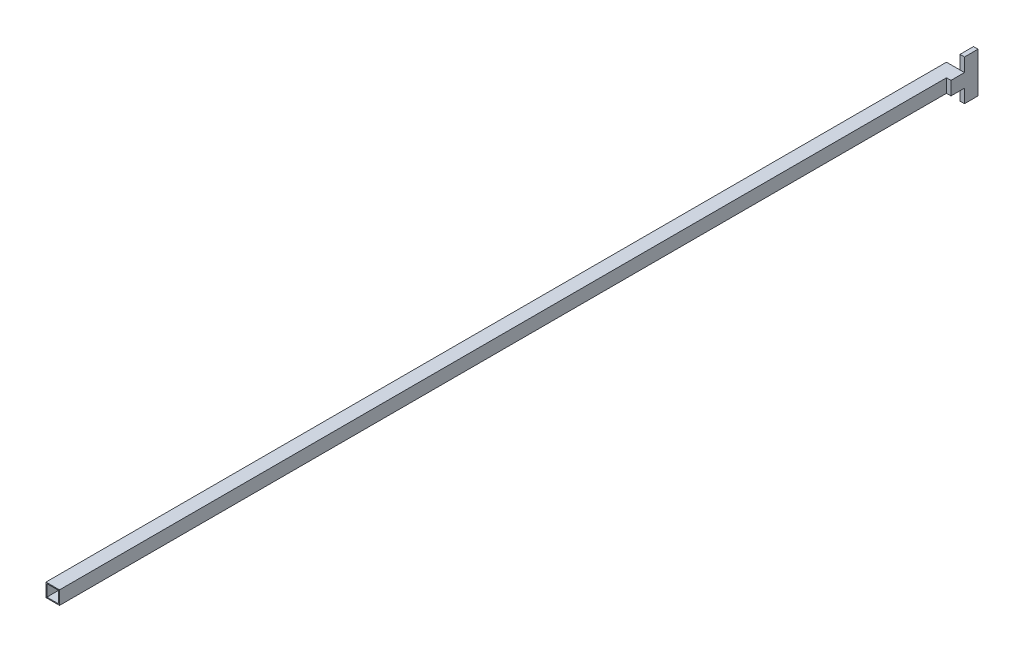
ISO-10303-21;
HEADER;
FILE_DESCRIPTION(('STEP AP214'),'2;1');
FILE_NAME('part.step','',(''),(''),'','','');
FILE_SCHEMA(('AUTOMOTIVE_DESIGN { 1 0 10303 214 1 1 1 1 }'));
ENDSEC;
DATA;
#1=APPLICATION_CONTEXT('core data for automotive mechanical design processes');
#2=APPLICATION_PROTOCOL_DEFINITION('international standard','automotive_design',2000,#1);
#3=PRODUCT_CONTEXT('',#1,'mechanical');
#4=PRODUCT('Part','Part','',(#3));
#5=PRODUCT_RELATED_PRODUCT_CATEGORY('part','',(#4));
#6=PRODUCT_DEFINITION_FORMATION('','',#4);
#7=PRODUCT_DEFINITION_CONTEXT('part definition',#1,'design');
#8=PRODUCT_DEFINITION('design','',#6,#7);
#9=PRODUCT_DEFINITION_SHAPE('','',#8);
#10=(LENGTH_UNIT() NAMED_UNIT(*) SI_UNIT(.MILLI.,.METRE.));
#11=(NAMED_UNIT(*) PLANE_ANGLE_UNIT() SI_UNIT($,.RADIAN.));
#12=(NAMED_UNIT(*) SI_UNIT($,.STERADIAN.) SOLID_ANGLE_UNIT());
#13=UNCERTAINTY_MEASURE_WITH_UNIT(LENGTH_MEASURE(1.E-05),#10,'distance_accuracy_value','');
#14=(GEOMETRIC_REPRESENTATION_CONTEXT(3) GLOBAL_UNCERTAINTY_ASSIGNED_CONTEXT((#13)) GLOBAL_UNIT_ASSIGNED_CONTEXT((#10,
#11,#12)) REPRESENTATION_CONTEXT('',''));
#15=CARTESIAN_POINT('',(0.,0.,0.));
#16=DIRECTION('',(0.,0.,1.));
#17=DIRECTION('',(1.,0.,0.));
#18=AXIS2_PLACEMENT_3D('',#15,#16,#17);
#19=CARTESIAN_POINT('',(15.,15.,2000.));
#20=DIRECTION('',(-1.,0.,0.));
#21=DIRECTION('',(0.,0.,1.));
#22=AXIS2_PLACEMENT_3D('',#19,#20,#21);
#23=PLANE('',#22);
#24=DIRECTION('',(0.,-1.,0.));
#25=VECTOR('',#24,1.);
#26=CARTESIAN_POINT('',(15.,15.,30.));
#27=LINE('',#26,#25);
#28=CARTESIAN_POINT('',(15.,15.,30.));
#29=VERTEX_POINT('',#28);
#30=CARTESIAN_POINT('',(15.,-15.,30.));
#31=VERTEX_POINT('',#30);
#32=EDGE_CURVE('E55',#29,#31,#27,.T.);
#33=ORIENTED_EDGE('',*,*,#32,.F.);
#34=DIRECTION('',(0.,0.,-1.));
#35=VECTOR('',#34,1.);
#36=CARTESIAN_POINT('',(15.,15.,2000.));
#37=LINE('',#36,#35);
#38=CARTESIAN_POINT('',(15.,15.,2000.));
#39=VERTEX_POINT('',#38);
#40=EDGE_CURVE('E308',#39,#29,#37,.T.);
#41=ORIENTED_EDGE('',*,*,#40,.F.);
#42=DIRECTION('',(0.,1.,0.));
#43=VECTOR('',#42,1.);
#44=CARTESIAN_POINT('',(15.,15.,2000.));
#45=LINE('',#44,#43);
#46=CARTESIAN_POINT('',(15.,-15.,2000.));
#47=VERTEX_POINT('',#46);
#48=EDGE_CURVE('E286',#47,#39,#45,.T.);
#49=ORIENTED_EDGE('',*,*,#48,.F.);
#50=DIRECTION('',(0.,0.,-1.));
#51=VECTOR('',#50,1.);
#52=CARTESIAN_POINT('',(15.,-15.,2000.));
#53=LINE('',#52,#51);
#54=EDGE_CURVE('E48',#47,#31,#53,.T.);
#55=ORIENTED_EDGE('',*,*,#54,.T.);
#56=EDGE_LOOP('',(#33,#41,#49,#55));
#57=FACE_BOUND('',#56,.T.);
#58=ADVANCED_FACE('F39',(#57),#23,.F.);
#59=CARTESIAN_POINT('',(0.,0.,2000.));
#60=DIRECTION('',(0.,0.,-1.));
#61=DIRECTION('',(-1.,0.,0.));
#62=AXIS2_PLACEMENT_3D('',#59,#60,#61);
#63=PLANE('',#62);
#64=DIRECTION('',(0.,-1.,0.));
#65=VECTOR('',#64,1.);
#66=CARTESIAN_POINT('',(-15.,15.,2000.));
#67=LINE('',#66,#65);
#68=CARTESIAN_POINT('',(-15.,15.,2000.));
#69=VERTEX_POINT('',#68);
#70=CARTESIAN_POINT('',(-15.,-15.,2000.));
#71=VERTEX_POINT('',#70);
#72=EDGE_CURVE('E278',#69,#71,#67,.T.);
#73=ORIENTED_EDGE('',*,*,#72,.T.);
#74=DIRECTION('',(1.,0.,0.));
#75=VECTOR('',#74,1.);
#76=CARTESIAN_POINT('',(15.,-15.,2000.));
#77=LINE('',#76,#75);
#78=EDGE_CURVE('E282',#71,#47,#77,.T.);
#79=ORIENTED_EDGE('',*,*,#78,.T.);
#80=ORIENTED_EDGE('',*,*,#48,.T.);
#81=DIRECTION('',(-1.,0.,0.));
#82=VECTOR('',#81,1.);
#83=CARTESIAN_POINT('',(15.,15.,2000.));
#84=LINE('',#83,#82);
#85=EDGE_CURVE('E289',#39,#69,#84,.T.);
#86=ORIENTED_EDGE('',*,*,#85,.T.);
#87=EDGE_LOOP('',(#73,#79,#80,#86));
#88=FACE_BOUND('',#87,.T.);
#89=DIRECTION('',(0.,-1.,0.));
#90=VECTOR('',#89,1.);
#91=CARTESIAN_POINT('',(-13.,13.,2000.));
#92=LINE('',#91,#90);
#93=CARTESIAN_POINT('',(-13.,13.,2000.));
#94=VERTEX_POINT('',#93);
#95=CARTESIAN_POINT('',(-13.,-13.,2000.));
#96=VERTEX_POINT('',#95);
#97=EDGE_CURVE('E237',#94,#96,#92,.T.);
#98=ORIENTED_EDGE('',*,*,#97,.F.);
#99=DIRECTION('',(-1.,0.,0.));
#100=VECTOR('',#99,1.);
#101=CARTESIAN_POINT('',(13.,13.,2000.));
#102=LINE('',#101,#100);
#103=CARTESIAN_POINT('',(13.,13.,2000.));
#104=VERTEX_POINT('',#103);
#105=EDGE_CURVE('E247',#104,#94,#102,.T.);
#106=ORIENTED_EDGE('',*,*,#105,.F.);
#107=DIRECTION('',(0.,1.,0.));
#108=VECTOR('',#107,1.);
#109=CARTESIAN_POINT('',(13.,13.,2000.));
#110=LINE('',#109,#108);
#111=CARTESIAN_POINT('',(13.,-13.,2000.));
#112=VERTEX_POINT('',#111);
#113=EDGE_CURVE('E244',#112,#104,#110,.T.);
#114=ORIENTED_EDGE('',*,*,#113,.F.);
#115=DIRECTION('',(1.,0.,0.));
#116=VECTOR('',#115,1.);
#117=CARTESIAN_POINT('',(13.,-13.,2000.));
#118=LINE('',#117,#116);
#119=EDGE_CURVE('E240',#96,#112,#118,.T.);
#120=ORIENTED_EDGE('',*,*,#119,.F.);
#121=EDGE_LOOP('',(#98,#106,#114,#120));
#122=FACE_BOUND('',#121,.T.);
#123=ADVANCED_FACE('F349',(#88,#122),#63,.F.);
#124=CARTESIAN_POINT('',(0.,0.,0.));
#125=DIRECTION('',(0.,0.,-1.));
#126=DIRECTION('',(-1.,0.,0.));
#127=AXIS2_PLACEMENT_3D('',#124,#125,#126);
#128=PLANE('',#127);
#129=DIRECTION('',(0.,-1.,0.));
#130=VECTOR('',#129,1.);
#131=CARTESIAN_POINT('',(-15.,15.,0.));
#132=LINE('',#131,#130);
#133=CARTESIAN_POINT('',(-15.,15.,0.));
#134=VERTEX_POINT('',#133);
#135=CARTESIAN_POINT('',(-15.,-15.,0.));
#136=VERTEX_POINT('',#135);
#137=EDGE_CURVE('E277',#134,#136,#132,.T.);
#138=ORIENTED_EDGE('',*,*,#137,.F.);
#139=DIRECTION('',(-1.,0.,0.));
#140=VECTOR('',#139,1.);
#141=CARTESIAN_POINT('',(15.,15.,0.));
#142=LINE('',#141,#140);
#143=CARTESIAN_POINT('',(15.,15.,0.));
#144=VERTEX_POINT('',#143);
#145=EDGE_CURVE('E283',#144,#134,#142,.T.);
#146=ORIENTED_EDGE('',*,*,#145,.F.);
#147=DIRECTION('',(0.,1.,0.));
#148=VECTOR('',#147,1.);
#149=CARTESIAN_POINT('',(15.,15.,0.));
#150=LINE('',#149,#148);
#151=CARTESIAN_POINT('',(15.,-15.,0.));
#152=VERTEX_POINT('',#151);
#153=EDGE_CURVE('E299',#152,#144,#150,.T.);
#154=ORIENTED_EDGE('',*,*,#153,.F.);
#155=DIRECTION('',(1.,0.,0.));
#156=VECTOR('',#155,1.);
#157=CARTESIAN_POINT('',(15.,-15.,0.));
#158=LINE('',#157,#156);
#159=EDGE_CURVE('E296',#136,#152,#158,.T.);
#160=ORIENTED_EDGE('',*,*,#159,.F.);
#161=EDGE_LOOP('',(#138,#146,#154,#160));
#162=FACE_BOUND('',#161,.T.);
#163=DIRECTION('',(-1.,0.,0.));
#164=VECTOR('',#163,1.);
#165=CARTESIAN_POINT('',(13.,13.,0.));
#166=LINE('',#165,#164);
#167=CARTESIAN_POINT('',(13.,13.,0.));
#168=VERTEX_POINT('',#167);
#169=CARTESIAN_POINT('',(-13.,13.,0.));
#170=VERTEX_POINT('',#169);
#171=EDGE_CURVE('E241',#168,#170,#166,.T.);
#172=ORIENTED_EDGE('',*,*,#171,.T.);
#173=DIRECTION('',(0.,-1.,0.));
#174=VECTOR('',#173,1.);
#175=CARTESIAN_POINT('',(-13.,13.,0.));
#176=LINE('',#175,#174);
#177=CARTESIAN_POINT('',(-13.,-13.,0.));
#178=VERTEX_POINT('',#177);
#179=EDGE_CURVE('E216',#170,#178,#176,.T.);
#180=ORIENTED_EDGE('',*,*,#179,.T.);
#181=DIRECTION('',(1.,0.,0.));
#182=VECTOR('',#181,1.);
#183=CARTESIAN_POINT('',(13.,-13.,0.));
#184=LINE('',#183,#182);
#185=CARTESIAN_POINT('',(13.,-13.,0.));
#186=VERTEX_POINT('',#185);
#187=EDGE_CURVE('E254',#178,#186,#184,.T.);
#188=ORIENTED_EDGE('',*,*,#187,.T.);
#189=DIRECTION('',(0.,1.,0.));
#190=VECTOR('',#189,1.);
#191=CARTESIAN_POINT('',(13.,13.,0.));
#192=LINE('',#191,#190);
#193=EDGE_CURVE('E258',#186,#168,#192,.T.);
#194=ORIENTED_EDGE('',*,*,#193,.T.);
#195=EDGE_LOOP('',(#172,#180,#188,#194));
#196=FACE_BOUND('',#195,.T.);
#197=ADVANCED_FACE('F341',(#162,#196),#128,.T.);
#198=CARTESIAN_POINT('',(-15.,15.,2000.));
#199=DIRECTION('',(1.,0.,0.));
#200=DIRECTION('',(0.,0.,-1.));
#201=AXIS2_PLACEMENT_3D('',#198,#199,#200);
#202=PLANE('',#201);
#203=ORIENTED_EDGE('',*,*,#137,.T.);
#204=DIRECTION('',(0.,0.,-1.));
#205=VECTOR('',#204,1.);
#206=CARTESIAN_POINT('',(-15.,-15.,2000.));
#207=LINE('',#206,#205);
#208=EDGE_CURVE('E11',#71,#136,#207,.T.);
#209=ORIENTED_EDGE('',*,*,#208,.F.);
#210=ORIENTED_EDGE('',*,*,#72,.F.);
#211=DIRECTION('',(0.,0.,-1.));
#212=VECTOR('',#211,1.);
#213=CARTESIAN_POINT('',(-15.,15.,2000.));
#214=LINE('',#213,#212);
#215=EDGE_CURVE('E292',#69,#134,#214,.T.);
#216=ORIENTED_EDGE('',*,*,#215,.T.);
#217=EDGE_LOOP('',(#203,#209,#210,#216));
#218=FACE_BOUND('',#217,.T.);
#219=ADVANCED_FACE('F41',(#218),#202,.F.);
#220=CARTESIAN_POINT('',(15.,-15.,2000.));
#221=DIRECTION('',(0.,1.,0.));
#222=DIRECTION('',(0.,0.,1.));
#223=AXIS2_PLACEMENT_3D('',#220,#221,#222);
#224=PLANE('',#223);
#225=ORIENTED_EDGE('',*,*,#159,.T.);
#226=DIRECTION('',(-1.,0.,0.));
#227=VECTOR('',#226,1.);
#228=CARTESIAN_POINT('',(25.,-15.,0.));
#229=LINE('',#228,#227);
#230=CARTESIAN_POINT('',(25.,-15.,0.));
#231=VERTEX_POINT('',#230);
#232=EDGE_CURVE('E221',#231,#152,#229,.T.);
#233=ORIENTED_EDGE('',*,*,#232,.F.);
#234=DIRECTION('',(0.,0.,-1.));
#235=VECTOR('',#234,1.);
#236=CARTESIAN_POINT('',(25.,-15.,30.));
#237=LINE('',#236,#235);
#238=CARTESIAN_POINT('',(25.,-15.,30.));
#239=VERTEX_POINT('',#238);
#240=EDGE_CURVE('E192',#239,#231,#237,.T.);
#241=ORIENTED_EDGE('',*,*,#240,.F.);
#242=DIRECTION('',(-1.,0.,0.));
#243=VECTOR('',#242,1.);
#244=CARTESIAN_POINT('',(25.,-15.,30.));
#245=LINE('',#244,#243);
#246=EDGE_CURVE('E217',#239,#31,#245,.T.);
#247=ORIENTED_EDGE('',*,*,#246,.T.);
#248=ORIENTED_EDGE('',*,*,#54,.F.);
#249=ORIENTED_EDGE('',*,*,#78,.F.);
#250=ORIENTED_EDGE('',*,*,#208,.T.);
#251=EDGE_LOOP('',(#225,#233,#241,#247,#248,#249,#250));
#252=FACE_BOUND('',#251,.T.);
#253=ADVANCED_FACE('F318',(#252),#224,.F.);
#254=CARTESIAN_POINT('',(15.,15.,2000.));
#255=DIRECTION('',(0.,-1.,0.));
#256=DIRECTION('',(0.,0.,-1.));
#257=AXIS2_PLACEMENT_3D('',#254,#255,#256);
#258=PLANE('',#257);
#259=ORIENTED_EDGE('',*,*,#145,.T.);
#260=ORIENTED_EDGE('',*,*,#215,.F.);
#261=ORIENTED_EDGE('',*,*,#85,.F.);
#262=ORIENTED_EDGE('',*,*,#40,.T.);
#263=DIRECTION('',(-1.,0.,0.));
#264=VECTOR('',#263,1.);
#265=CARTESIAN_POINT('',(25.,15.,30.));
#266=LINE('',#265,#264);
#267=CARTESIAN_POINT('',(25.,15.,30.));
#268=VERTEX_POINT('',#267);
#269=EDGE_CURVE('E172',#268,#29,#266,.T.);
#270=ORIENTED_EDGE('',*,*,#269,.F.);
#271=DIRECTION('',(0.,0.,-1.));
#272=VECTOR('',#271,1.);
#273=CARTESIAN_POINT('',(25.,15.,30.));
#274=LINE('',#273,#272);
#275=CARTESIAN_POINT('',(25.,15.,0.));
#276=VERTEX_POINT('',#275);
#277=EDGE_CURVE('E164',#268,#276,#274,.T.);
#278=ORIENTED_EDGE('',*,*,#277,.T.);
#279=DIRECTION('',(-1.,0.,0.));
#280=VECTOR('',#279,1.);
#281=CARTESIAN_POINT('',(25.,15.,0.));
#282=LINE('',#281,#280);
#283=EDGE_CURVE('E149',#276,#144,#282,.T.);
#284=ORIENTED_EDGE('',*,*,#283,.T.);
#285=EDGE_LOOP('',(#259,#260,#261,#262,#270,#278,#284));
#286=FACE_BOUND('',#285,.T.);
#287=ADVANCED_FACE('F170',(#286),#258,.F.);
#288=CARTESIAN_POINT('',(-13.,13.,2000.));
#289=DIRECTION('',(1.,0.,0.));
#290=DIRECTION('',(0.,0.,-1.));
#291=AXIS2_PLACEMENT_3D('',#288,#289,#290);
#292=PLANE('',#291);
#293=ORIENTED_EDGE('',*,*,#179,.F.);
#294=DIRECTION('',(0.,0.,-1.));
#295=VECTOR('',#294,1.);
#296=CARTESIAN_POINT('',(-13.,13.,2000.));
#297=LINE('',#296,#295);
#298=EDGE_CURVE('E250',#94,#170,#297,.T.);
#299=ORIENTED_EDGE('',*,*,#298,.F.);
#300=ORIENTED_EDGE('',*,*,#97,.T.);
#301=DIRECTION('',(0.,0.,-1.));
#302=VECTOR('',#301,1.);
#303=CARTESIAN_POINT('',(-13.,-13.,2000.));
#304=LINE('',#303,#302);
#305=EDGE_CURVE('E273',#96,#178,#304,.T.);
#306=ORIENTED_EDGE('',*,*,#305,.T.);
#307=EDGE_LOOP('',(#293,#299,#300,#306));
#308=FACE_BOUND('',#307,.T.);
#309=ADVANCED_FACE('F360',(#308),#292,.T.);
#310=CARTESIAN_POINT('',(13.,-13.,2000.));
#311=DIRECTION('',(0.,1.,0.));
#312=DIRECTION('',(0.,0.,1.));
#313=AXIS2_PLACEMENT_3D('',#310,#311,#312);
#314=PLANE('',#313);
#315=ORIENTED_EDGE('',*,*,#187,.F.);
#316=ORIENTED_EDGE('',*,*,#305,.F.);
#317=ORIENTED_EDGE('',*,*,#119,.T.);
#318=DIRECTION('',(0.,0.,-1.));
#319=VECTOR('',#318,1.);
#320=CARTESIAN_POINT('',(13.,-13.,2000.));
#321=LINE('',#320,#319);
#322=EDGE_CURVE('E270',#112,#186,#321,.T.);
#323=ORIENTED_EDGE('',*,*,#322,.T.);
#324=EDGE_LOOP('',(#315,#316,#317,#323));
#325=FACE_BOUND('',#324,.T.);
#326=ADVANCED_FACE('F362',(#325),#314,.T.);
#327=CARTESIAN_POINT('',(13.,13.,2000.));
#328=DIRECTION('',(-1.,0.,0.));
#329=DIRECTION('',(0.,0.,1.));
#330=AXIS2_PLACEMENT_3D('',#327,#328,#329);
#331=PLANE('',#330);
#332=ORIENTED_EDGE('',*,*,#193,.F.);
#333=ORIENTED_EDGE('',*,*,#322,.F.);
#334=ORIENTED_EDGE('',*,*,#113,.T.);
#335=DIRECTION('',(0.,0.,-1.));
#336=VECTOR('',#335,1.);
#337=CARTESIAN_POINT('',(13.,13.,2000.));
#338=LINE('',#337,#336);
#339=EDGE_CURVE('E63',#104,#168,#338,.T.);
#340=ORIENTED_EDGE('',*,*,#339,.T.);
#341=EDGE_LOOP('',(#332,#333,#334,#340));
#342=FACE_BOUND('',#341,.T.);
#343=ADVANCED_FACE('F367',(#342),#331,.T.);
#344=CARTESIAN_POINT('',(13.,13.,2000.));
#345=DIRECTION('',(0.,-1.,0.));
#346=DIRECTION('',(0.,0.,-1.));
#347=AXIS2_PLACEMENT_3D('',#344,#345,#346);
#348=PLANE('',#347);
#349=ORIENTED_EDGE('',*,*,#171,.F.);
#350=ORIENTED_EDGE('',*,*,#339,.F.);
#351=ORIENTED_EDGE('',*,*,#105,.T.);
#352=ORIENTED_EDGE('',*,*,#298,.T.);
#353=EDGE_LOOP('',(#349,#350,#351,#352));
#354=FACE_BOUND('',#353,.T.);
#355=ADVANCED_FACE('F365',(#354),#348,.T.);
#356=CARTESIAN_POINT('',(15.,0.,0.));
#357=DIRECTION('',(1.,0.,0.));
#358=DIRECTION('',(0.,0.,-1.));
#359=AXIS2_PLACEMENT_3D('',#356,#357,#358);
#360=PLANE('',#359);
#361=DIRECTION('',(0.,-1.,0.));
#362=VECTOR('',#361,1.);
#363=CARTESIAN_POINT('',(15.,-15.,0.));
#364=LINE('',#363,#362);
#365=CARTESIAN_POINT('',(15.,-45.,0.));
#366=VERTEX_POINT('',#365);
#367=EDGE_CURVE('E177',#152,#366,#364,.T.);
#368=ORIENTED_EDGE('',*,*,#367,.F.);
#369=ORIENTED_EDGE('',*,*,#153,.T.);
#370=DIRECTION('',(0.,1.,0.));
#371=VECTOR('',#370,1.);
#372=CARTESIAN_POINT('',(15.,15.,0.));
#373=LINE('',#372,#371);
#374=CARTESIAN_POINT('',(15.,45.,0.));
#375=VERTEX_POINT('',#374);
#376=EDGE_CURVE('E154',#144,#375,#373,.T.);
#377=ORIENTED_EDGE('',*,*,#376,.T.);
#378=DIRECTION('',(0.,0.,1.));
#379=VECTOR('',#378,1.);
#380=CARTESIAN_POINT('',(15.,45.,-30.));
#381=LINE('',#380,#379);
#382=CARTESIAN_POINT('',(15.,45.,-30.));
#383=VERTEX_POINT('',#382);
#384=EDGE_CURVE('E199',#383,#375,#381,.T.);
#385=ORIENTED_EDGE('',*,*,#384,.F.);
#386=DIRECTION('',(0.,-1.,0.));
#387=VECTOR('',#386,1.);
#388=CARTESIAN_POINT('',(15.,-15.,-30.));
#389=LINE('',#388,#387);
#390=CARTESIAN_POINT('',(15.,-45.,-30.));
#391=VERTEX_POINT('',#390);
#392=EDGE_CURVE('E203',#383,#391,#389,.T.);
#393=ORIENTED_EDGE('',*,*,#392,.T.);
#394=DIRECTION('',(0.,0.,1.));
#395=VECTOR('',#394,1.);
#396=CARTESIAN_POINT('',(15.,-45.,-30.));
#397=LINE('',#396,#395);
#398=EDGE_CURVE('E207',#391,#366,#397,.T.);
#399=ORIENTED_EDGE('',*,*,#398,.T.);
#400=EDGE_LOOP('',(#368,#369,#377,#385,#393,#399));
#401=FACE_BOUND('',#400,.T.);
#402=ADVANCED_FACE('F337',(#401),#360,.F.);
#403=CARTESIAN_POINT('',(25.,15.,30.));
#404=DIRECTION('',(0.,0.,-1.));
#405=DIRECTION('',(0.,1.,0.));
#406=AXIS2_PLACEMENT_3D('',#403,#404,#405);
#407=PLANE('',#406);
#408=ORIENTED_EDGE('',*,*,#32,.T.);
#409=ORIENTED_EDGE('',*,*,#246,.F.);
#410=DIRECTION('',(0.,-1.,0.));
#411=VECTOR('',#410,1.);
#412=CARTESIAN_POINT('',(25.,15.,30.));
#413=LINE('',#412,#411);
#414=EDGE_CURVE('E159',#268,#239,#413,.T.);
#415=ORIENTED_EDGE('',*,*,#414,.F.);
#416=ORIENTED_EDGE('',*,*,#269,.T.);
#417=EDGE_LOOP('',(#408,#409,#415,#416));
#418=FACE_BOUND('',#417,.T.);
#419=ADVANCED_FACE('F316',(#418),#407,.F.);
#420=CARTESIAN_POINT('',(25.,-15.,0.));
#421=DIRECTION('',(0.,0.,-1.));
#422=DIRECTION('',(0.,1.,0.));
#423=AXIS2_PLACEMENT_3D('',#420,#421,#422);
#424=PLANE('',#423);
#425=ORIENTED_EDGE('',*,*,#367,.T.);
#426=DIRECTION('',(-1.,0.,0.));
#427=VECTOR('',#426,1.);
#428=CARTESIAN_POINT('',(25.,-45.,0.));
#429=LINE('',#428,#427);
#430=CARTESIAN_POINT('',(25.,-45.,0.));
#431=VERTEX_POINT('',#430);
#432=EDGE_CURVE('E225',#431,#366,#429,.T.);
#433=ORIENTED_EDGE('',*,*,#432,.F.);
#434=DIRECTION('',(0.,-1.,0.));
#435=VECTOR('',#434,1.);
#436=CARTESIAN_POINT('',(25.,-15.,0.));
#437=LINE('',#436,#435);
#438=EDGE_CURVE('E189',#231,#431,#437,.T.);
#439=ORIENTED_EDGE('',*,*,#438,.F.);
#440=ORIENTED_EDGE('',*,*,#232,.T.);
#441=EDGE_LOOP('',(#425,#433,#439,#440));
#442=FACE_BOUND('',#441,.T.);
#443=ADVANCED_FACE('F324',(#442),#424,.F.);
#444=CARTESIAN_POINT('',(25.,-45.,-30.));
#445=DIRECTION('',(0.,-1.,0.));
#446=DIRECTION('',(0.,0.,-1.));
#447=AXIS2_PLACEMENT_3D('',#444,#445,#446);
#448=PLANE('',#447);
#449=ORIENTED_EDGE('',*,*,#398,.F.);
#450=DIRECTION('',(-1.,0.,0.));
#451=VECTOR('',#450,1.);
#452=CARTESIAN_POINT('',(25.,-45.,-30.));
#453=LINE('',#452,#451);
#454=CARTESIAN_POINT('',(25.,-45.,-30.));
#455=VERTEX_POINT('',#454);
#456=EDGE_CURVE('E228',#455,#391,#453,.T.);
#457=ORIENTED_EDGE('',*,*,#456,.F.);
#458=DIRECTION('',(0.,0.,1.));
#459=VECTOR('',#458,1.);
#460=CARTESIAN_POINT('',(25.,-45.,-30.));
#461=LINE('',#460,#459);
#462=EDGE_CURVE('E185',#455,#431,#461,.T.);
#463=ORIENTED_EDGE('',*,*,#462,.T.);
#464=ORIENTED_EDGE('',*,*,#432,.T.);
#465=EDGE_LOOP('',(#449,#457,#463,#464));
#466=FACE_BOUND('',#465,.T.);
#467=ADVANCED_FACE('F329',(#466),#448,.T.);
#468=CARTESIAN_POINT('',(25.,-15.,-30.));
#469=DIRECTION('',(0.,0.,-1.));
#470=DIRECTION('',(0.,1.,0.));
#471=AXIS2_PLACEMENT_3D('',#468,#469,#470);
#472=PLANE('',#471);
#473=ORIENTED_EDGE('',*,*,#392,.F.);
#474=DIRECTION('',(-1.,0.,0.));
#475=VECTOR('',#474,1.);
#476=CARTESIAN_POINT('',(25.,45.,-30.));
#477=LINE('',#476,#475);
#478=CARTESIAN_POINT('',(25.,45.,-30.));
#479=VERTEX_POINT('',#478);
#480=EDGE_CURVE('E231',#479,#383,#477,.T.);
#481=ORIENTED_EDGE('',*,*,#480,.F.);
#482=DIRECTION('',(0.,1.,0.));
#483=VECTOR('',#482,1.);
#484=CARTESIAN_POINT('',(25.,15.,-30.));
#485=LINE('',#484,#483);
#486=EDGE_CURVE('E182',#455,#479,#485,.T.);
#487=ORIENTED_EDGE('',*,*,#486,.F.);
#488=ORIENTED_EDGE('',*,*,#456,.T.);
#489=EDGE_LOOP('',(#473,#481,#487,#488));
#490=FACE_BOUND('',#489,.T.);
#491=ADVANCED_FACE('F331',(#490),#472,.T.);
#492=CARTESIAN_POINT('',(25.,45.,-30.));
#493=DIRECTION('',(0.,-1.,0.));
#494=DIRECTION('',(0.,0.,-1.));
#495=AXIS2_PLACEMENT_3D('',#492,#493,#494);
#496=PLANE('',#495);
#497=ORIENTED_EDGE('',*,*,#384,.T.);
#498=DIRECTION('',(-1.,0.,0.));
#499=VECTOR('',#498,1.);
#500=CARTESIAN_POINT('',(25.,45.,0.));
#501=LINE('',#500,#499);
#502=CARTESIAN_POINT('',(25.,45.,0.));
#503=VERTEX_POINT('',#502);
#504=EDGE_CURVE('E158',#503,#375,#501,.T.);
#505=ORIENTED_EDGE('',*,*,#504,.F.);
#506=DIRECTION('',(0.,0.,1.));
#507=VECTOR('',#506,1.);
#508=CARTESIAN_POINT('',(25.,45.,-30.));
#509=LINE('',#508,#507);
#510=EDGE_CURVE('E166',#479,#503,#509,.T.);
#511=ORIENTED_EDGE('',*,*,#510,.F.);
#512=ORIENTED_EDGE('',*,*,#480,.T.);
#513=EDGE_LOOP('',(#497,#505,#511,#512));
#514=FACE_BOUND('',#513,.T.);
#515=ADVANCED_FACE('F335',(#514),#496,.F.);
#516=CARTESIAN_POINT('',(25.,15.,0.));
#517=DIRECTION('',(0.,0.,1.));
#518=DIRECTION('',(1.,0.,0.));
#519=AXIS2_PLACEMENT_3D('',#516,#517,#518);
#520=PLANE('',#519);
#521=ORIENTED_EDGE('',*,*,#376,.F.);
#522=ORIENTED_EDGE('',*,*,#283,.F.);
#523=DIRECTION('',(0.,1.,0.));
#524=VECTOR('',#523,1.);
#525=CARTESIAN_POINT('',(25.,15.,0.));
#526=LINE('',#525,#524);
#527=EDGE_CURVE('E152',#276,#503,#526,.T.);
#528=ORIENTED_EDGE('',*,*,#527,.T.);
#529=ORIENTED_EDGE('',*,*,#504,.T.);
#530=EDGE_LOOP('',(#521,#522,#528,#529));
#531=FACE_BOUND('',#530,.T.);
#532=ADVANCED_FACE('F151',(#531),#520,.T.);
#533=CARTESIAN_POINT('',(25.,0.,0.));
#534=DIRECTION('',(1.,0.,0.));
#535=DIRECTION('',(0.,0.,-1.));
#536=AXIS2_PLACEMENT_3D('',#533,#534,#535);
#537=PLANE('',#536);
#538=ORIENTED_EDGE('',*,*,#277,.F.);
#539=ORIENTED_EDGE('',*,*,#414,.T.);
#540=ORIENTED_EDGE('',*,*,#240,.T.);
#541=ORIENTED_EDGE('',*,*,#438,.T.);
#542=ORIENTED_EDGE('',*,*,#462,.F.);
#543=ORIENTED_EDGE('',*,*,#486,.T.);
#544=ORIENTED_EDGE('',*,*,#510,.T.);
#545=ORIENTED_EDGE('',*,*,#527,.F.);
#546=EDGE_LOOP('',(#538,#539,#540,#541,#542,#543,#544,#545));
#547=FACE_BOUND('',#546,.T.);
#548=ADVANCED_FACE('F163',(#547),#537,.T.);
#549=CLOSED_SHELL('',(#58,#123,#197,#219,#253,#287,#309,#326,#343,#355,#402,#419,#443,#467,#491,
#515,#532,#548));
#550=MANIFOLD_SOLID_BREP('B2',#549);
#551=ADVANCED_BREP_SHAPE_REPRESENTATION('',(#18,#550),#14);
#552=SHAPE_DEFINITION_REPRESENTATION(#9,#551);
ENDSEC;
END-ISO-10303-21;
